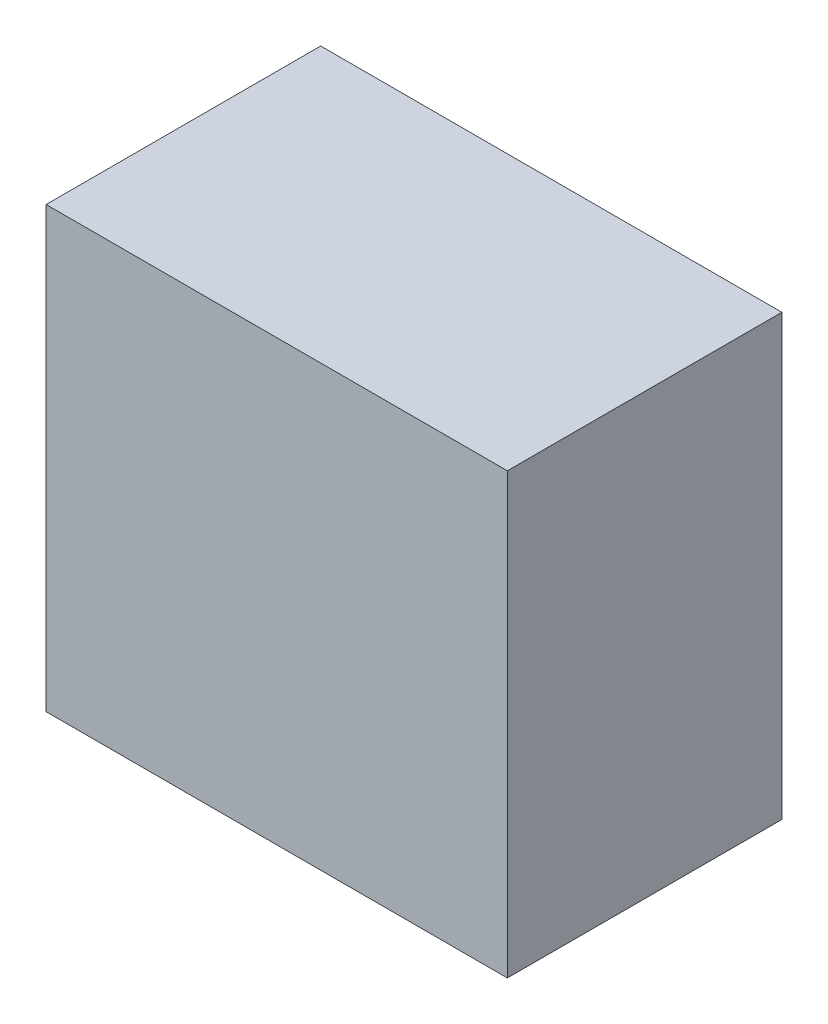
ISO-10303-21;
HEADER;
FILE_DESCRIPTION(('STEP AP214'),'2;1');
FILE_NAME('part.step','',(''),(''),'','','');
FILE_SCHEMA(('AUTOMOTIVE_DESIGN { 1 0 10303 214 1 1 1 1 }'));
ENDSEC;
DATA;
#1=APPLICATION_CONTEXT('core data for automotive mechanical design processes');
#2=APPLICATION_PROTOCOL_DEFINITION('international standard','automotive_design',2000,#1);
#3=PRODUCT_CONTEXT('',#1,'mechanical');
#4=PRODUCT('Part','Part','',(#3));
#5=PRODUCT_RELATED_PRODUCT_CATEGORY('part','',(#4));
#6=PRODUCT_DEFINITION_FORMATION('','',#4);
#7=PRODUCT_DEFINITION_CONTEXT('part definition',#1,'design');
#8=PRODUCT_DEFINITION('design','',#6,#7);
#9=PRODUCT_DEFINITION_SHAPE('','',#8);
#10=(LENGTH_UNIT() NAMED_UNIT(*) SI_UNIT(.MILLI.,.METRE.));
#11=(NAMED_UNIT(*) PLANE_ANGLE_UNIT() SI_UNIT($,.RADIAN.));
#12=(NAMED_UNIT(*) SI_UNIT($,.STERADIAN.) SOLID_ANGLE_UNIT());
#13=UNCERTAINTY_MEASURE_WITH_UNIT(LENGTH_MEASURE(1.E-05),#10,'distance_accuracy_value','');
#14=(GEOMETRIC_REPRESENTATION_CONTEXT(3) GLOBAL_UNCERTAINTY_ASSIGNED_CONTEXT((#13)) GLOBAL_UNIT_ASSIGNED_CONTEXT((#10,
#11,#12)) REPRESENTATION_CONTEXT('',''));
#15=CARTESIAN_POINT('',(0.,0.,0.));
#16=DIRECTION('',(0.,0.,1.));
#17=DIRECTION('',(1.,0.,0.));
#18=AXIS2_PLACEMENT_3D('',#15,#16,#17);
#19=CARTESIAN_POINT('',(-42.,80.,25.));
#20=DIRECTION('',(1.,0.,0.));
#21=DIRECTION('',(0.,0.,-1.));
#22=AXIS2_PLACEMENT_3D('',#19,#20,#21);
#23=PLANE('',#22);
#24=DIRECTION('',(0.,0.,1.));
#25=VECTOR('',#24,1.);
#26=CARTESIAN_POINT('',(-42.,0.,25.));
#27=LINE('',#26,#25);
#28=CARTESIAN_POINT('',(-42.,0.,-25.));
#29=VERTEX_POINT('',#28);
#30=CARTESIAN_POINT('',(-42.,0.,25.));
#31=VERTEX_POINT('',#30);
#32=EDGE_CURVE('E100',#29,#31,#27,.T.);
#33=ORIENTED_EDGE('',*,*,#32,.T.);
#34=DIRECTION('',(0.,-1.,0.));
#35=VECTOR('',#34,1.);
#36=CARTESIAN_POINT('',(-42.,80.,25.));
#37=LINE('',#36,#35);
#38=CARTESIAN_POINT('',(-42.,80.,25.));
#39=VERTEX_POINT('',#38);
#40=EDGE_CURVE('E11',#39,#31,#37,.T.);
#41=ORIENTED_EDGE('',*,*,#40,.F.);
#42=DIRECTION('',(0.,0.,1.));
#43=VECTOR('',#42,1.);
#44=CARTESIAN_POINT('',(-42.,80.,25.));
#45=LINE('',#44,#43);
#46=CARTESIAN_POINT('',(-42.,80.,-25.));
#47=VERTEX_POINT('',#46);
#48=EDGE_CURVE('E88',#47,#39,#45,.T.);
#49=ORIENTED_EDGE('',*,*,#48,.F.);
#50=DIRECTION('',(0.,-1.,0.));
#51=VECTOR('',#50,1.);
#52=CARTESIAN_POINT('',(-42.,80.,-25.));
#53=LINE('',#52,#51);
#54=EDGE_CURVE('E96',#47,#29,#53,.T.);
#55=ORIENTED_EDGE('',*,*,#54,.T.);
#56=EDGE_LOOP('',(#33,#41,#49,#55));
#57=FACE_BOUND('',#56,.T.);
#58=ADVANCED_FACE('F37',(#57),#23,.F.);
#59=CARTESIAN_POINT('',(42.,80.,25.));
#60=DIRECTION('',(0.,0.,-1.));
#61=DIRECTION('',(-1.,0.,0.));
#62=AXIS2_PLACEMENT_3D('',#59,#60,#61);
#63=PLANE('',#62);
#64=DIRECTION('',(1.,0.,0.));
#65=VECTOR('',#64,1.);
#66=CARTESIAN_POINT('',(42.,0.,25.));
#67=LINE('',#66,#65);
#68=CARTESIAN_POINT('',(42.,0.,25.));
#69=VERTEX_POINT('',#68);
#70=EDGE_CURVE('E92',#31,#69,#67,.T.);
#71=ORIENTED_EDGE('',*,*,#70,.T.);
#72=DIRECTION('',(0.,-1.,0.));
#73=VECTOR('',#72,1.);
#74=CARTESIAN_POINT('',(42.,80.,25.));
#75=LINE('',#74,#73);
#76=CARTESIAN_POINT('',(42.,80.,25.));
#77=VERTEX_POINT('',#76);
#78=EDGE_CURVE('E45',#77,#69,#75,.T.);
#79=ORIENTED_EDGE('',*,*,#78,.F.);
#80=DIRECTION('',(1.,0.,0.));
#81=VECTOR('',#80,1.);
#82=CARTESIAN_POINT('',(42.,80.,25.));
#83=LINE('',#82,#81);
#84=EDGE_CURVE('E83',#39,#77,#83,.T.);
#85=ORIENTED_EDGE('',*,*,#84,.F.);
#86=ORIENTED_EDGE('',*,*,#40,.T.);
#87=EDGE_LOOP('',(#71,#79,#85,#86));
#88=FACE_BOUND('',#87,.T.);
#89=ADVANCED_FACE('F91',(#88),#63,.F.);
#90=CARTESIAN_POINT('',(42.,80.,25.));
#91=DIRECTION('',(-1.,0.,0.));
#92=DIRECTION('',(0.,0.,1.));
#93=AXIS2_PLACEMENT_3D('',#90,#91,#92);
#94=PLANE('',#93);
#95=DIRECTION('',(0.,0.,-1.));
#96=VECTOR('',#95,1.);
#97=CARTESIAN_POINT('',(42.,0.,25.));
#98=LINE('',#97,#96);
#99=CARTESIAN_POINT('',(42.,0.,-25.));
#100=VERTEX_POINT('',#99);
#101=EDGE_CURVE('E70',#69,#100,#98,.T.);
#102=ORIENTED_EDGE('',*,*,#101,.T.);
#103=DIRECTION('',(0.,-1.,0.));
#104=VECTOR('',#103,1.);
#105=CARTESIAN_POINT('',(42.,80.,-25.));
#106=LINE('',#105,#104);
#107=CARTESIAN_POINT('',(42.,80.,-25.));
#108=VERTEX_POINT('',#107);
#109=EDGE_CURVE('E93',#108,#100,#106,.T.);
#110=ORIENTED_EDGE('',*,*,#109,.F.);
#111=DIRECTION('',(0.,0.,-1.));
#112=VECTOR('',#111,1.);
#113=CARTESIAN_POINT('',(42.,80.,25.));
#114=LINE('',#113,#112);
#115=EDGE_CURVE('E86',#77,#108,#114,.T.);
#116=ORIENTED_EDGE('',*,*,#115,.F.);
#117=ORIENTED_EDGE('',*,*,#78,.T.);
#118=EDGE_LOOP('',(#102,#110,#116,#117));
#119=FACE_BOUND('',#118,.T.);
#120=ADVANCED_FACE('F94',(#119),#94,.F.);
#121=CARTESIAN_POINT('',(42.,80.,-25.));
#122=DIRECTION('',(0.,0.,1.));
#123=DIRECTION('',(1.,0.,0.));
#124=AXIS2_PLACEMENT_3D('',#121,#122,#123);
#125=PLANE('',#124);
#126=DIRECTION('',(-1.,0.,0.));
#127=VECTOR('',#126,1.);
#128=CARTESIAN_POINT('',(42.,0.,-25.));
#129=LINE('',#128,#127);
#130=EDGE_CURVE('E76',#100,#29,#129,.T.);
#131=ORIENTED_EDGE('',*,*,#130,.T.);
#132=ORIENTED_EDGE('',*,*,#54,.F.);
#133=DIRECTION('',(-1.,0.,0.));
#134=VECTOR('',#133,1.);
#135=CARTESIAN_POINT('',(42.,80.,-25.));
#136=LINE('',#135,#134);
#137=EDGE_CURVE('E53',#108,#47,#136,.T.);
#138=ORIENTED_EDGE('',*,*,#137,.F.);
#139=ORIENTED_EDGE('',*,*,#109,.T.);
#140=EDGE_LOOP('',(#131,#132,#138,#139));
#141=FACE_BOUND('',#140,.T.);
#142=ADVANCED_FACE('F107',(#141),#125,.F.);
#143=CARTESIAN_POINT('',(0.,80.,0.));
#144=DIRECTION('',(0.,1.,0.));
#145=DIRECTION('',(0.,0.,1.));
#146=AXIS2_PLACEMENT_3D('',#143,#144,#145);
#147=PLANE('',#146);
#148=ORIENTED_EDGE('',*,*,#48,.T.);
#149=ORIENTED_EDGE('',*,*,#84,.T.);
#150=ORIENTED_EDGE('',*,*,#115,.T.);
#151=ORIENTED_EDGE('',*,*,#137,.T.);
#152=EDGE_LOOP('',(#148,#149,#150,#151));
#153=FACE_BOUND('',#152,.T.);
#154=ADVANCED_FACE('F84',(#153),#147,.T.);
#155=CARTESIAN_POINT('',(0.,0.,0.));
#156=DIRECTION('',(0.,1.,0.));
#157=DIRECTION('',(0.,0.,1.));
#158=AXIS2_PLACEMENT_3D('',#155,#156,#157);
#159=PLANE('',#158);
#160=ORIENTED_EDGE('',*,*,#32,.F.);
#161=ORIENTED_EDGE('',*,*,#130,.F.);
#162=ORIENTED_EDGE('',*,*,#101,.F.);
#163=ORIENTED_EDGE('',*,*,#70,.F.);
#164=EDGE_LOOP('',(#160,#161,#162,#163));
#165=FACE_BOUND('',#164,.T.);
#166=ADVANCED_FACE('F110',(#165),#159,.F.);
#167=CLOSED_SHELL('',(#58,#89,#120,#142,#154,#166));
#168=MANIFOLD_SOLID_BREP('B2',#167);
#169=ADVANCED_BREP_SHAPE_REPRESENTATION('',(#18,#168),#14);
#170=SHAPE_DEFINITION_REPRESENTATION(#9,#169);
ENDSEC;
END-ISO-10303-21;
